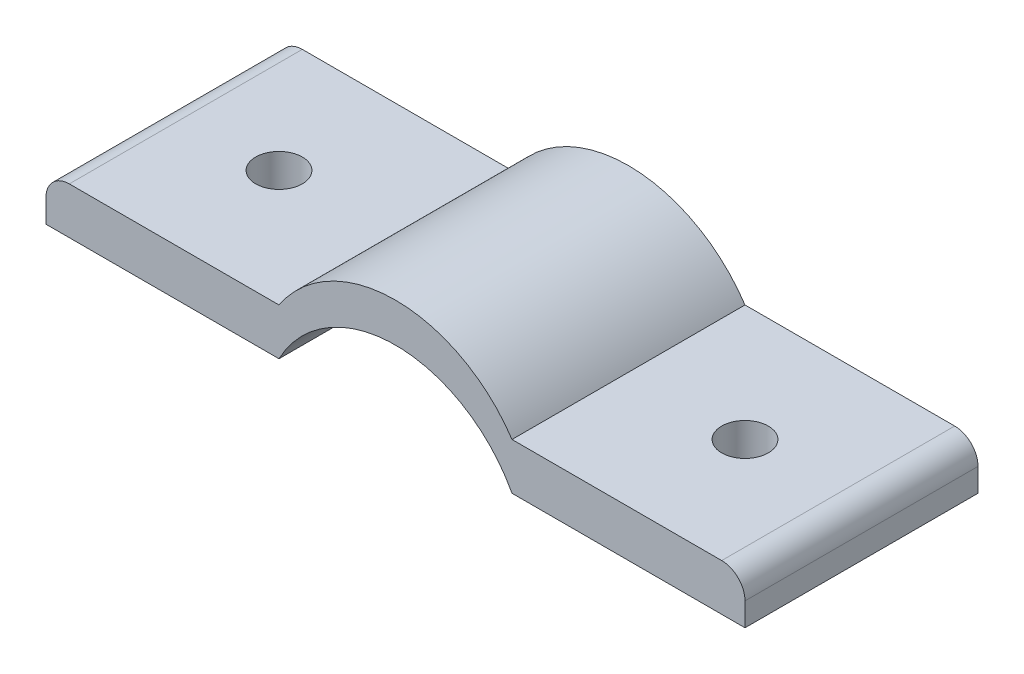
ISO-10303-21;
HEADER;
FILE_DESCRIPTION(('STEP AP214'),'2;1');
FILE_NAME('part.step','',(''),(''),'','','');
FILE_SCHEMA(('AUTOMOTIVE_DESIGN { 1 0 10303 214 1 1 1 1 }'));
ENDSEC;
DATA;
#1=APPLICATION_CONTEXT('core data for automotive mechanical design processes');
#2=APPLICATION_PROTOCOL_DEFINITION('international standard','automotive_design',2000,#1);
#3=PRODUCT_CONTEXT('',#1,'mechanical');
#4=PRODUCT('Part','Part','',(#3));
#5=PRODUCT_RELATED_PRODUCT_CATEGORY('part','',(#4));
#6=PRODUCT_DEFINITION_FORMATION('','',#4);
#7=PRODUCT_DEFINITION_CONTEXT('part definition',#1,'design');
#8=PRODUCT_DEFINITION('design','',#6,#7);
#9=PRODUCT_DEFINITION_SHAPE('','',#8);
#10=(LENGTH_UNIT() NAMED_UNIT(*) SI_UNIT(.MILLI.,.METRE.));
#11=(NAMED_UNIT(*) PLANE_ANGLE_UNIT() SI_UNIT($,.RADIAN.));
#12=(NAMED_UNIT(*) SI_UNIT($,.STERADIAN.) SOLID_ANGLE_UNIT());
#13=UNCERTAINTY_MEASURE_WITH_UNIT(LENGTH_MEASURE(1.E-05),#10,'distance_accuracy_value','');
#14=(GEOMETRIC_REPRESENTATION_CONTEXT(3) GLOBAL_UNCERTAINTY_ASSIGNED_CONTEXT((#13)) GLOBAL_UNIT_ASSIGNED_CONTEXT((#10,
#11,#12)) REPRESENTATION_CONTEXT('',''));
#15=CARTESIAN_POINT('',(0.,0.,0.));
#16=DIRECTION('',(0.,0.,1.));
#17=DIRECTION('',(1.,0.,0.));
#18=AXIS2_PLACEMENT_3D('',#15,#16,#17);
#19=CARTESIAN_POINT('',(-24.7058823529412,-2.5735294117647,10.));
#20=DIRECTION('',(1.,0.,0.));
#21=DIRECTION('',(0.,0.,-1.));
#22=AXIS2_PLACEMENT_3D('',#19,#20,#21);
#23=PLANE('',#22);
#24=DIRECTION('',(0.,-1.,0.));
#25=VECTOR('',#24,1.);
#26=CARTESIAN_POINT('',(-24.7058823529412,-2.5735294117647,10.));
#27=LINE('',#26,#25);
#28=CARTESIAN_POINT('',(-24.7058823529412,-1.5735294117647,10.));
#29=VERTEX_POINT('',#28);
#30=CARTESIAN_POINT('',(-24.7058823529412,-2.5735294117647,10.));
#31=VERTEX_POINT('',#30);
#32=EDGE_CURVE('E118',#29,#31,#27,.T.);
#33=ORIENTED_EDGE('',*,*,#32,.F.);
#34=DIRECTION('',(0.,0.,-1.));
#35=VECTOR('',#34,1.);
#36=CARTESIAN_POINT('',(-24.7058823529412,-1.5735294117647,10.));
#37=LINE('',#36,#35);
#38=CARTESIAN_POINT('',(-24.7058823529412,-1.5735294117647,0.));
#39=VERTEX_POINT('',#38);
#40=EDGE_CURVE('E52',#29,#39,#37,.T.);
#41=ORIENTED_EDGE('',*,*,#40,.T.);
#42=DIRECTION('',(0.,-1.,0.));
#43=VECTOR('',#42,1.);
#44=CARTESIAN_POINT('',(-24.7058823529412,-2.5735294117647,0.));
#45=LINE('',#44,#43);
#46=CARTESIAN_POINT('',(-24.7058823529412,-2.5735294117647,0.));
#47=VERTEX_POINT('',#46);
#48=EDGE_CURVE('E142',#39,#47,#45,.T.);
#49=ORIENTED_EDGE('',*,*,#48,.T.);
#50=DIRECTION('',(0.,0.,-1.));
#51=VECTOR('',#50,1.);
#52=CARTESIAN_POINT('',(-24.7058823529412,-2.5735294117647,10.));
#53=LINE('',#52,#51);
#54=EDGE_CURVE('E134',#31,#47,#53,.T.);
#55=ORIENTED_EDGE('',*,*,#54,.F.);
#56=EDGE_LOOP('',(#33,#41,#49,#55));
#57=FACE_BOUND('',#56,.T.);
#58=ADVANCED_FACE('F43',(#57),#23,.F.);
#59=CARTESIAN_POINT('',(-24.7058823529412,-2.5735294117647,10.));
#60=DIRECTION('',(0.,1.,0.));
#61=DIRECTION('',(0.,0.,1.));
#62=AXIS2_PLACEMENT_3D('',#59,#60,#61);
#63=PLANE('',#62);
#64=CARTESIAN_POINT('',(-19.7058823529412,-2.5735294117647,5.));
#65=DIRECTION('',(0.,1.,0.));
#66=DIRECTION('',(0.,0.,1.));
#67=AXIS2_PLACEMENT_3D('',#64,#65,#66);
#68=CIRCLE('',#67,1.);
#69=CARTESIAN_POINT('',(-19.7058823529412,-2.5735294117647,6.));
#70=VERTEX_POINT('',#69);
#71=EDGE_CURVE('E184',#70,#70,#68,.T.);
#72=ORIENTED_EDGE('',*,*,#71,.T.);
#73=EDGE_LOOP('',(#72));
#74=FACE_BOUND('',#73,.T.);
#75=DIRECTION('',(1.,0.,0.));
#76=VECTOR('',#75,1.);
#77=CARTESIAN_POINT('',(-24.7058823529412,-2.5735294117647,0.));
#78=LINE('',#77,#76);
#79=CARTESIAN_POINT('',(-14.7058823529412,-2.5735294117647,0.));
#80=VERTEX_POINT('',#79);
#81=EDGE_CURVE('E175',#47,#80,#78,.T.);
#82=ORIENTED_EDGE('',*,*,#81,.T.);
#83=DIRECTION('',(0.,0.,-1.));
#84=VECTOR('',#83,1.);
#85=CARTESIAN_POINT('',(-14.7058823529412,-2.5735294117647,10.));
#86=LINE('',#85,#84);
#87=CARTESIAN_POINT('',(-14.7058823529412,-2.5735294117647,10.));
#88=VERTEX_POINT('',#87);
#89=EDGE_CURVE('E136',#88,#80,#86,.T.);
#90=ORIENTED_EDGE('',*,*,#89,.F.);
#91=DIRECTION('',(1.,0.,0.));
#92=VECTOR('',#91,1.);
#93=CARTESIAN_POINT('',(-24.7058823529412,-2.5735294117647,10.));
#94=LINE('',#93,#92);
#95=EDGE_CURVE('E122',#31,#88,#94,.T.);
#96=ORIENTED_EDGE('',*,*,#95,.F.);
#97=ORIENTED_EDGE('',*,*,#54,.T.);
#98=EDGE_LOOP('',(#82,#90,#96,#97));
#99=FACE_BOUND('',#98,.T.);
#100=ADVANCED_FACE('F133',(#74,#99),#63,.F.);
#101=CARTESIAN_POINT('',(-9.70588235294118,-5.22492653586071,10.));
#102=DIRECTION('',(0.,0.,-1.));
#103=DIRECTION('',(-1.,0.,0.));
#104=AXIS2_PLACEMENT_3D('',#101,#102,#103);
#105=CYLINDRICAL_SURFACE('',#104,5.6594970368103);
#106=CARTESIAN_POINT('',(-9.70588235294118,-5.22492653586071,0.));
#107=DIRECTION('',(0.,0.,-1.));
#108=DIRECTION('',(-1.,0.,0.));
#109=AXIS2_PLACEMENT_3D('',#106,#107,#108);
#110=CIRCLE('',#109,5.6594970368103);
#111=CARTESIAN_POINT('',(-4.70588235294118,-2.57352941176471,0.));
#112=VERTEX_POINT('',#111);
#113=EDGE_CURVE('E181',#80,#112,#110,.T.);
#114=ORIENTED_EDGE('',*,*,#113,.T.);
#115=DIRECTION('',(0.,0.,-1.));
#116=VECTOR('',#115,1.);
#117=CARTESIAN_POINT('',(-4.70588235294118,-2.57352941176471,10.));
#118=LINE('',#117,#116);
#119=CARTESIAN_POINT('',(-4.70588235294118,-2.57352941176471,10.));
#120=VERTEX_POINT('',#119);
#121=EDGE_CURVE('E152',#120,#112,#118,.T.);
#122=ORIENTED_EDGE('',*,*,#121,.F.);
#123=CARTESIAN_POINT('',(-9.70588235294118,-5.22492653586071,10.));
#124=DIRECTION('',(0.,0.,-1.));
#125=DIRECTION('',(-1.,0.,0.));
#126=AXIS2_PLACEMENT_3D('',#123,#124,#125);
#127=CIRCLE('',#126,5.6594970368103);
#128=EDGE_CURVE('E139',#88,#120,#127,.T.);
#129=ORIENTED_EDGE('',*,*,#128,.F.);
#130=ORIENTED_EDGE('',*,*,#89,.T.);
#131=EDGE_LOOP('',(#114,#122,#129,#130));
#132=FACE_BOUND('',#131,.T.);
#133=ADVANCED_FACE('F286',(#132),#105,.F.);
#134=CARTESIAN_POINT('',(-4.70588235294118,-2.5735294117647,10.));
#135=DIRECTION('',(0.,1.,0.));
#136=DIRECTION('',(0.,0.,1.));
#137=AXIS2_PLACEMENT_3D('',#134,#135,#136);
#138=PLANE('',#137);
#139=CARTESIAN_POINT('',(0.294117647058821,-2.5735294117647,5.));
#140=DIRECTION('',(0.,1.,0.));
#141=DIRECTION('',(0.,0.,1.));
#142=AXIS2_PLACEMENT_3D('',#139,#140,#141);
#143=CIRCLE('',#142,1.);
#144=CARTESIAN_POINT('',(0.294117647058821,-2.5735294117647,6.));
#145=VERTEX_POINT('',#144);
#146=EDGE_CURVE('E177',#145,#145,#143,.T.);
#147=ORIENTED_EDGE('',*,*,#146,.T.);
#148=EDGE_LOOP('',(#147));
#149=FACE_BOUND('',#148,.T.);
#150=DIRECTION('',(1.,0.,0.));
#151=VECTOR('',#150,1.);
#152=CARTESIAN_POINT('',(-4.70588235294118,-2.5735294117647,0.));
#153=LINE('',#152,#151);
#154=CARTESIAN_POINT('',(5.29411764705882,-2.5735294117647,0.));
#155=VERTEX_POINT('',#154);
#156=EDGE_CURVE('E192',#112,#155,#153,.T.);
#157=ORIENTED_EDGE('',*,*,#156,.T.);
#158=DIRECTION('',(0.,0.,-1.));
#159=VECTOR('',#158,1.);
#160=CARTESIAN_POINT('',(5.29411764705882,-2.5735294117647,10.));
#161=LINE('',#160,#159);
#162=CARTESIAN_POINT('',(5.29411764705882,-2.5735294117647,10.));
#163=VERTEX_POINT('',#162);
#164=EDGE_CURVE('E215',#163,#155,#161,.T.);
#165=ORIENTED_EDGE('',*,*,#164,.F.);
#166=DIRECTION('',(1.,0.,0.));
#167=VECTOR('',#166,1.);
#168=CARTESIAN_POINT('',(-4.70588235294118,-2.5735294117647,10.));
#169=LINE('',#168,#167);
#170=EDGE_CURVE('E226',#120,#163,#169,.T.);
#171=ORIENTED_EDGE('',*,*,#170,.F.);
#172=ORIENTED_EDGE('',*,*,#121,.T.);
#173=EDGE_LOOP('',(#157,#165,#171,#172));
#174=FACE_BOUND('',#173,.T.);
#175=ADVANCED_FACE('F224',(#149,#174),#138,.F.);
#176=CARTESIAN_POINT('',(5.29411764705882,-2.5735294117647,10.));
#177=DIRECTION('',(-1.,0.,0.));
#178=DIRECTION('',(0.,0.,1.));
#179=AXIS2_PLACEMENT_3D('',#176,#177,#178);
#180=PLANE('',#179);
#181=DIRECTION('',(0.,1.,0.));
#182=VECTOR('',#181,1.);
#183=CARTESIAN_POINT('',(5.29411764705882,-2.5735294117647,0.));
#184=LINE('',#183,#182);
#185=CARTESIAN_POINT('',(5.29411764705882,-1.5735294117647,0.));
#186=VERTEX_POINT('',#185);
#187=EDGE_CURVE('E195',#155,#186,#184,.T.);
#188=ORIENTED_EDGE('',*,*,#187,.T.);
#189=DIRECTION('',(0.,0.,-1.));
#190=VECTOR('',#189,1.);
#191=CARTESIAN_POINT('',(5.29411764705882,-1.5735294117647,10.));
#192=LINE('',#191,#190);
#193=CARTESIAN_POINT('',(5.29411764705882,-1.5735294117647,10.));
#194=VERTEX_POINT('',#193);
#195=EDGE_CURVE('E161',#186,#194,#192,.F.);
#196=ORIENTED_EDGE('',*,*,#195,.T.);
#197=DIRECTION('',(0.,1.,0.));
#198=VECTOR('',#197,1.);
#199=CARTESIAN_POINT('',(5.29411764705882,-2.5735294117647,10.));
#200=LINE('',#199,#198);
#201=EDGE_CURVE('E240',#163,#194,#200,.T.);
#202=ORIENTED_EDGE('',*,*,#201,.F.);
#203=ORIENTED_EDGE('',*,*,#164,.T.);
#204=EDGE_LOOP('',(#188,#196,#202,#203));
#205=FACE_BOUND('',#204,.T.);
#206=ADVANCED_FACE('F231',(#205),#180,.F.);
#207=CARTESIAN_POINT('',(5.29411764705882,-0.573529411764705,10.));
#208=DIRECTION('',(0.,-1.,0.));
#209=DIRECTION('',(0.,0.,-1.));
#210=AXIS2_PLACEMENT_3D('',#207,#208,#209);
#211=PLANE('',#210);
#212=CARTESIAN_POINT('',(0.294117647058821,-0.573529411764705,5.));
#213=DIRECTION('',(0.,1.,0.));
#214=DIRECTION('',(0.,0.,1.));
#215=AXIS2_PLACEMENT_3D('',#212,#213,#214);
#216=CIRCLE('',#215,1.);
#217=CARTESIAN_POINT('',(0.294117647058821,-0.573529411764705,6.));
#218=VERTEX_POINT('',#217);
#219=EDGE_CURVE('E258',#218,#218,#216,.T.);
#220=ORIENTED_EDGE('',*,*,#219,.F.);
#221=EDGE_LOOP('',(#220));
#222=FACE_BOUND('',#221,.T.);
#223=DIRECTION('',(-1.,0.,0.));
#224=VECTOR('',#223,1.);
#225=CARTESIAN_POINT('',(5.29411764705882,-0.573529411764705,10.));
#226=LINE('',#225,#224);
#227=CARTESIAN_POINT('',(4.29411764705882,-0.573529411764705,10.));
#228=VERTEX_POINT('',#227);
#229=CARTESIAN_POINT('',(-4.70588235294118,-0.573529411764705,10.));
#230=VERTEX_POINT('',#229);
#231=EDGE_CURVE('E238',#228,#230,#226,.T.);
#232=ORIENTED_EDGE('',*,*,#231,.F.);
#233=DIRECTION('',(0.,0.,-1.));
#234=VECTOR('',#233,1.);
#235=CARTESIAN_POINT('',(4.29411764705882,-0.573529411764705,10.));
#236=LINE('',#235,#234);
#237=CARTESIAN_POINT('',(4.29411764705882,-0.573529411764705,0.));
#238=VERTEX_POINT('',#237);
#239=EDGE_CURVE('E145',#228,#238,#236,.T.);
#240=ORIENTED_EDGE('',*,*,#239,.T.);
#241=DIRECTION('',(-1.,0.,0.));
#242=VECTOR('',#241,1.);
#243=CARTESIAN_POINT('',(5.29411764705882,-0.573529411764705,0.));
#244=LINE('',#243,#242);
#245=CARTESIAN_POINT('',(-4.70588235294118,-0.573529411764705,0.));
#246=VERTEX_POINT('',#245);
#247=EDGE_CURVE('E199',#238,#246,#244,.T.);
#248=ORIENTED_EDGE('',*,*,#247,.T.);
#249=DIRECTION('',(0.,0.,-1.));
#250=VECTOR('',#249,1.);
#251=CARTESIAN_POINT('',(-4.70588235294118,-0.573529411764705,10.));
#252=LINE('',#251,#250);
#253=EDGE_CURVE('E211',#230,#246,#252,.T.);
#254=ORIENTED_EDGE('',*,*,#253,.F.);
#255=EDGE_LOOP('',(#232,#240,#248,#254));
#256=FACE_BOUND('',#255,.T.);
#257=ADVANCED_FACE('F242',(#222,#256),#211,.F.);
#258=CARTESIAN_POINT('',(-9.70588235294118,-3.89657099271562,10.));
#259=DIRECTION('',(0.,0.,-1.));
#260=DIRECTION('',(-1.,0.,0.));
#261=AXIS2_PLACEMENT_3D('',#258,#259,#260);
#262=CYLINDRICAL_SURFACE('',#261,6.00354939587647);
#263=CARTESIAN_POINT('',(-9.70588235294118,-3.89657099271562,0.));
#264=DIRECTION('',(0.,0.,1.));
#265=DIRECTION('',(-1.,0.,0.));
#266=AXIS2_PLACEMENT_3D('',#263,#264,#265);
#267=CIRCLE('',#266,6.00354939587647);
#268=CARTESIAN_POINT('',(-14.7058823529412,-0.573529411764705,0.));
#269=VERTEX_POINT('',#268);
#270=EDGE_CURVE('E202',#246,#269,#267,.T.);
#271=ORIENTED_EDGE('',*,*,#270,.T.);
#272=DIRECTION('',(0.,0.,-1.));
#273=VECTOR('',#272,1.);
#274=CARTESIAN_POINT('',(-14.7058823529412,-0.573529411764705,10.));
#275=LINE('',#274,#273);
#276=CARTESIAN_POINT('',(-14.7058823529412,-0.573529411764705,10.));
#277=VERTEX_POINT('',#276);
#278=EDGE_CURVE('E207',#277,#269,#275,.T.);
#279=ORIENTED_EDGE('',*,*,#278,.F.);
#280=CARTESIAN_POINT('',(-9.70588235294118,-3.89657099271562,10.));
#281=DIRECTION('',(0.,0.,1.));
#282=DIRECTION('',(-1.,0.,0.));
#283=AXIS2_PLACEMENT_3D('',#280,#281,#282);
#284=CIRCLE('',#283,6.00354939587647);
#285=EDGE_CURVE('E245',#230,#277,#284,.T.);
#286=ORIENTED_EDGE('',*,*,#285,.F.);
#287=ORIENTED_EDGE('',*,*,#253,.T.);
#288=EDGE_LOOP('',(#271,#279,#286,#287));
#289=FACE_BOUND('',#288,.T.);
#290=ADVANCED_FACE('F271',(#289),#262,.T.);
#291=CARTESIAN_POINT('',(-24.7058823529412,-0.573529411764705,10.));
#292=DIRECTION('',(0.,-1.,0.));
#293=DIRECTION('',(0.,0.,-1.));
#294=AXIS2_PLACEMENT_3D('',#291,#292,#293);
#295=PLANE('',#294);
#296=CARTESIAN_POINT('',(-19.7058823529412,-0.573529411764705,5.));
#297=DIRECTION('',(0.,1.,0.));
#298=DIRECTION('',(0.,0.,1.));
#299=AXIS2_PLACEMENT_3D('',#296,#297,#298);
#300=CIRCLE('',#299,1.);
#301=CARTESIAN_POINT('',(-19.7058823529412,-0.573529411764705,6.));
#302=VERTEX_POINT('',#301);
#303=EDGE_CURVE('E259',#302,#302,#300,.T.);
#304=ORIENTED_EDGE('',*,*,#303,.F.);
#305=EDGE_LOOP('',(#304));
#306=FACE_BOUND('',#305,.T.);
#307=DIRECTION('',(-1.,0.,0.));
#308=VECTOR('',#307,1.);
#309=CARTESIAN_POINT('',(-24.7058823529412,-0.573529411764705,0.));
#310=LINE('',#309,#308);
#311=CARTESIAN_POINT('',(-23.7058823529412,-0.573529411764705,0.));
#312=VERTEX_POINT('',#311);
#313=EDGE_CURVE('E129',#269,#312,#310,.T.);
#314=ORIENTED_EDGE('',*,*,#313,.T.);
#315=DIRECTION('',(0.,0.,-1.));
#316=VECTOR('',#315,1.);
#317=CARTESIAN_POINT('',(-23.7058823529412,-0.573529411764705,10.));
#318=LINE('',#317,#316);
#319=CARTESIAN_POINT('',(-23.7058823529412,-0.573529411764705,10.));
#320=VERTEX_POINT('',#319);
#321=EDGE_CURVE('E11',#312,#320,#318,.F.);
#322=ORIENTED_EDGE('',*,*,#321,.T.);
#323=DIRECTION('',(-1.,0.,0.));
#324=VECTOR('',#323,1.);
#325=CARTESIAN_POINT('',(-24.7058823529412,-0.573529411764705,10.));
#326=LINE('',#325,#324);
#327=EDGE_CURVE('E187',#277,#320,#326,.T.);
#328=ORIENTED_EDGE('',*,*,#327,.F.);
#329=ORIENTED_EDGE('',*,*,#278,.T.);
#330=EDGE_LOOP('',(#314,#322,#328,#329));
#331=FACE_BOUND('',#330,.T.);
#332=ADVANCED_FACE('F277',(#306,#331),#295,.F.);
#333=CARTESIAN_POINT('',(-9.70588235294118,-3.89657099271562,10.));
#334=DIRECTION('',(0.,0.,-1.));
#335=DIRECTION('',(-1.,0.,0.));
#336=AXIS2_PLACEMENT_3D('',#333,#334,#335);
#337=PLANE('',#336);
#338=ORIENTED_EDGE('',*,*,#201,.T.);
#339=CARTESIAN_POINT('',(4.29411764705882,-1.5735294117647,10.));
#340=DIRECTION('',(0.,0.,-1.));
#341=DIRECTION('',(-1.,0.,0.));
#342=AXIS2_PLACEMENT_3D('',#339,#340,#341);
#343=CIRCLE('',#342,1.);
#344=EDGE_CURVE('E166',#194,#228,#343,.F.);
#345=ORIENTED_EDGE('',*,*,#344,.T.);
#346=ORIENTED_EDGE('',*,*,#231,.T.);
#347=ORIENTED_EDGE('',*,*,#285,.T.);
#348=ORIENTED_EDGE('',*,*,#327,.T.);
#349=CARTESIAN_POINT('',(-23.7058823529412,-1.5735294117647,10.));
#350=DIRECTION('',(0.,0.,-1.));
#351=DIRECTION('',(-1.,0.,0.));
#352=AXIS2_PLACEMENT_3D('',#349,#350,#351);
#353=CIRCLE('',#352,1.);
#354=EDGE_CURVE('E64',#320,#29,#353,.F.);
#355=ORIENTED_EDGE('',*,*,#354,.T.);
#356=ORIENTED_EDGE('',*,*,#32,.T.);
#357=ORIENTED_EDGE('',*,*,#95,.T.);
#358=ORIENTED_EDGE('',*,*,#128,.T.);
#359=ORIENTED_EDGE('',*,*,#170,.T.);
#360=EDGE_LOOP('',(#338,#345,#346,#347,#348,#355,#356,#357,#358,#359));
#361=FACE_BOUND('',#360,.T.);
#362=ADVANCED_FACE('F121',(#361),#337,.F.);
#363=CARTESIAN_POINT('',(-9.70588235294118,-3.89657099271562,0.));
#364=DIRECTION('',(0.,0.,-1.));
#365=DIRECTION('',(-1.,0.,0.));
#366=AXIS2_PLACEMENT_3D('',#363,#364,#365);
#367=PLANE('',#366);
#368=ORIENTED_EDGE('',*,*,#247,.F.);
#369=CARTESIAN_POINT('',(4.29411764705882,-1.5735294117647,0.));
#370=DIRECTION('',(0.,0.,-1.));
#371=DIRECTION('',(-1.,0.,0.));
#372=AXIS2_PLACEMENT_3D('',#369,#370,#371);
#373=CIRCLE('',#372,1.);
#374=EDGE_CURVE('E158',#238,#186,#373,.T.);
#375=ORIENTED_EDGE('',*,*,#374,.T.);
#376=ORIENTED_EDGE('',*,*,#187,.F.);
#377=ORIENTED_EDGE('',*,*,#156,.F.);
#378=ORIENTED_EDGE('',*,*,#113,.F.);
#379=ORIENTED_EDGE('',*,*,#81,.F.);
#380=ORIENTED_EDGE('',*,*,#48,.F.);
#381=CARTESIAN_POINT('',(-23.7058823529412,-1.5735294117647,0.));
#382=DIRECTION('',(0.,0.,-1.));
#383=DIRECTION('',(-1.,0.,0.));
#384=AXIS2_PLACEMENT_3D('',#381,#382,#383);
#385=CIRCLE('',#384,1.);
#386=EDGE_CURVE('E150',#39,#312,#385,.T.);
#387=ORIENTED_EDGE('',*,*,#386,.T.);
#388=ORIENTED_EDGE('',*,*,#313,.F.);
#389=ORIENTED_EDGE('',*,*,#270,.F.);
#390=EDGE_LOOP('',(#368,#375,#376,#377,#378,#379,#380,#387,#388,#389));
#391=FACE_BOUND('',#390,.T.);
#392=ADVANCED_FACE('F172',(#391),#367,.T.);
#393=CARTESIAN_POINT('',(-19.7058823529412,-10.5735294117647,5.));
#394=DIRECTION('',(0.,1.,0.));
#395=DIRECTION('',(0.,0.,1.));
#396=AXIS2_PLACEMENT_3D('',#393,#394,#395);
#397=CYLINDRICAL_SURFACE('',#396,1.);
#398=ORIENTED_EDGE('',*,*,#303,.T.);
#399=EDGE_LOOP('',(#398));
#400=FACE_BOUND('',#399,.T.);
#401=ORIENTED_EDGE('',*,*,#71,.F.);
#402=EDGE_LOOP('',(#401));
#403=FACE_BOUND('',#402,.T.);
#404=ADVANCED_FACE('F295',(#400,#403),#397,.F.);
#405=CARTESIAN_POINT('',(0.294117647058821,-10.5735294117647,5.));
#406=DIRECTION('',(0.,1.,0.));
#407=DIRECTION('',(0.,0.,1.));
#408=AXIS2_PLACEMENT_3D('',#405,#406,#407);
#409=CYLINDRICAL_SURFACE('',#408,1.);
#410=ORIENTED_EDGE('',*,*,#219,.T.);
#411=EDGE_LOOP('',(#410));
#412=FACE_BOUND('',#411,.T.);
#413=ORIENTED_EDGE('',*,*,#146,.F.);
#414=EDGE_LOOP('',(#413));
#415=FACE_BOUND('',#414,.T.);
#416=ADVANCED_FACE('F267',(#412,#415),#409,.F.);
#417=CARTESIAN_POINT('',(4.29411764705882,-1.5735294117647,10.));
#418=DIRECTION('',(0.,0.,-1.));
#419=DIRECTION('',(-1.,0.,0.));
#420=AXIS2_PLACEMENT_3D('',#417,#418,#419);
#421=CYLINDRICAL_SURFACE('',#420,1.);
#422=ORIENTED_EDGE('',*,*,#344,.F.);
#423=ORIENTED_EDGE('',*,*,#195,.F.);
#424=ORIENTED_EDGE('',*,*,#374,.F.);
#425=ORIENTED_EDGE('',*,*,#239,.F.);
#426=EDGE_LOOP('',(#422,#423,#424,#425));
#427=FACE_BOUND('',#426,.T.);
#428=ADVANCED_FACE('F235',(#427),#421,.T.);
#429=CARTESIAN_POINT('',(-23.7058823529412,-1.5735294117647,10.));
#430=DIRECTION('',(0.,0.,-1.));
#431=DIRECTION('',(-1.,0.,0.));
#432=AXIS2_PLACEMENT_3D('',#429,#430,#431);
#433=CYLINDRICAL_SURFACE('',#432,1.);
#434=ORIENTED_EDGE('',*,*,#354,.F.);
#435=ORIENTED_EDGE('',*,*,#321,.F.);
#436=ORIENTED_EDGE('',*,*,#386,.F.);
#437=ORIENTED_EDGE('',*,*,#40,.F.);
#438=EDGE_LOOP('',(#434,#435,#436,#437));
#439=FACE_BOUND('',#438,.T.);
#440=ADVANCED_FACE('F45',(#439),#433,.T.);
#441=CLOSED_SHELL('',(#58,#100,#133,#175,#206,#257,#290,#332,#362,#392,#404,#416,#428,#440));
#442=MANIFOLD_SOLID_BREP('B2',#441);
#443=ADVANCED_BREP_SHAPE_REPRESENTATION('',(#18,#442),#14);
#444=SHAPE_DEFINITION_REPRESENTATION(#9,#443);
ENDSEC;
END-ISO-10303-21;
